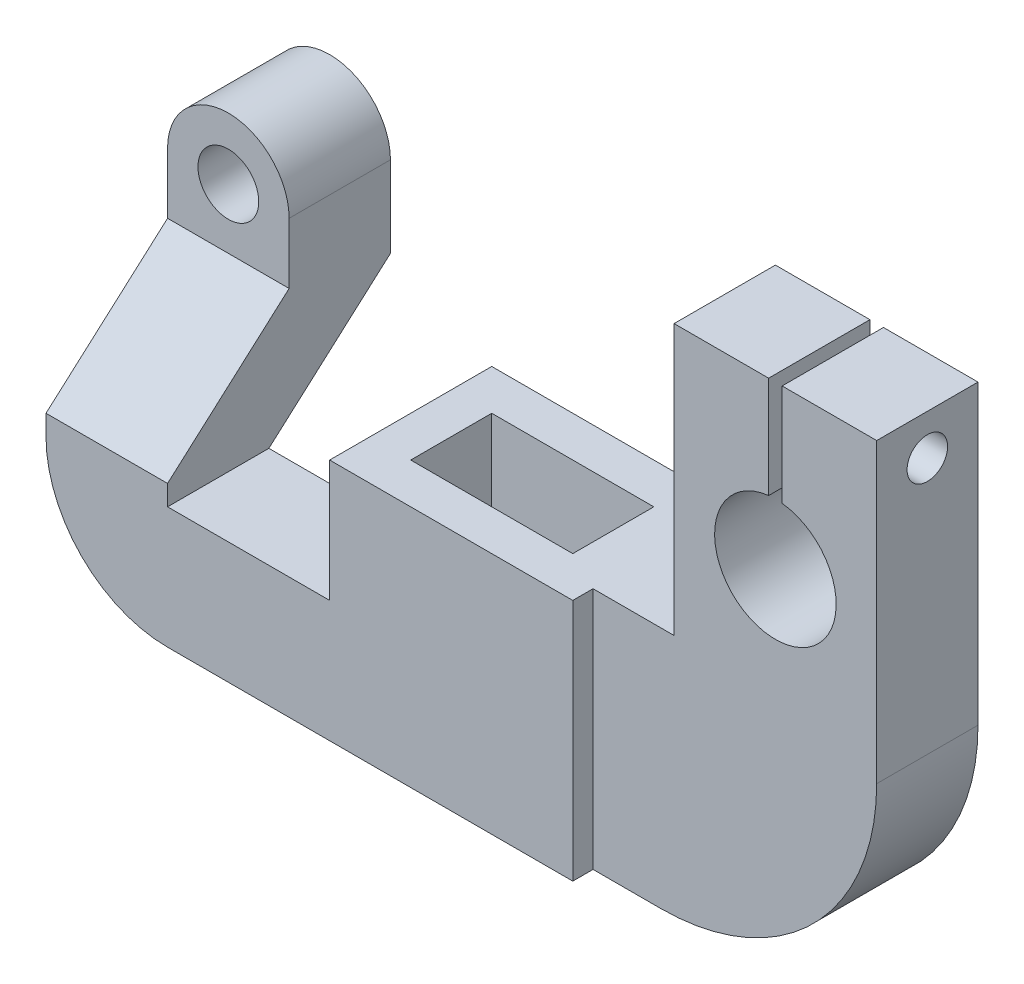
ISO-10303-21;
HEADER;
FILE_DESCRIPTION(('STEP AP214'),'2;1');
FILE_NAME('part.step','',(''),(''),'','','');
FILE_SCHEMA(('AUTOMOTIVE_DESIGN { 1 0 10303 214 1 1 1 1 }'));
ENDSEC;
DATA;
#1=APPLICATION_CONTEXT('core data for automotive mechanical design processes');
#2=APPLICATION_PROTOCOL_DEFINITION('international standard','automotive_design',2000,#1);
#3=PRODUCT_CONTEXT('',#1,'mechanical');
#4=PRODUCT('Part','Part','',(#3));
#5=PRODUCT_RELATED_PRODUCT_CATEGORY('part','',(#4));
#6=PRODUCT_DEFINITION_FORMATION('','',#4);
#7=PRODUCT_DEFINITION_CONTEXT('part definition',#1,'design');
#8=PRODUCT_DEFINITION('design','',#6,#7);
#9=PRODUCT_DEFINITION_SHAPE('','',#8);
#10=(LENGTH_UNIT() NAMED_UNIT(*) SI_UNIT(.MILLI.,.METRE.));
#11=(NAMED_UNIT(*) PLANE_ANGLE_UNIT() SI_UNIT($,.RADIAN.));
#12=(NAMED_UNIT(*) SI_UNIT($,.STERADIAN.) SOLID_ANGLE_UNIT());
#13=UNCERTAINTY_MEASURE_WITH_UNIT(LENGTH_MEASURE(1.E-05),#10,'distance_accuracy_value','');
#14=(GEOMETRIC_REPRESENTATION_CONTEXT(3) GLOBAL_UNCERTAINTY_ASSIGNED_CONTEXT((#13)) GLOBAL_UNIT_ASSIGNED_CONTEXT((#10,
#11,#12)) REPRESENTATION_CONTEXT('',''));
#15=CARTESIAN_POINT('',(0.,0.,0.));
#16=DIRECTION('',(0.,0.,1.));
#17=DIRECTION('',(1.,0.,0.));
#18=AXIS2_PLACEMENT_3D('',#15,#16,#17);
#19=CARTESIAN_POINT('',(-36.,-36.,0.));
#20=DIRECTION('',(-1.,0.,0.));
#21=DIRECTION('',(0.,0.,1.));
#22=AXIS2_PLACEMENT_3D('',#19,#20,#21);
#23=PLANE('',#22);
#24=DIRECTION('',(0.,0.,1.));
#25=VECTOR('',#24,1.);
#26=CARTESIAN_POINT('',(-36.,-36.,0.));
#27=LINE('',#26,#25);
#28=CARTESIAN_POINT('',(-36.,-36.,-6.));
#29=VERTEX_POINT('',#28);
#30=CARTESIAN_POINT('',(-36.,-36.,3.00000000000001));
#31=VERTEX_POINT('',#30);
#32=EDGE_CURVE('E320',#29,#31,#27,.T.);
#33=ORIENTED_EDGE('',*,*,#32,.T.);
#34=DIRECTION('',(0.,1.,0.));
#35=VECTOR('',#34,1.);
#36=CARTESIAN_POINT('',(-36.,-18.,3.00000000000001));
#37=LINE('',#36,#35);
#38=CARTESIAN_POINT('',(-36.,-18.,3.00000000000001));
#39=VERTEX_POINT('',#38);
#40=EDGE_CURVE('E294',#31,#39,#37,.T.);
#41=ORIENTED_EDGE('',*,*,#40,.T.);
#42=DIRECTION('',(0.,0.,1.));
#43=VECTOR('',#42,1.);
#44=CARTESIAN_POINT('',(-36.,-18.,3.00000000000001));
#45=LINE('',#44,#43);
#46=CARTESIAN_POINT('',(-36.,-18.,18.));
#47=VERTEX_POINT('',#46);
#48=EDGE_CURVE('E303',#39,#47,#45,.T.);
#49=ORIENTED_EDGE('',*,*,#48,.T.);
#50=DIRECTION('',(0.,1.,0.));
#51=VECTOR('',#50,1.);
#52=CARTESIAN_POINT('',(-36.,-36.,18.));
#53=LINE('',#52,#51);
#54=CARTESIAN_POINT('',(-36.,0.,18.));
#55=VERTEX_POINT('',#54);
#56=EDGE_CURVE('E368',#47,#55,#53,.T.);
#57=ORIENTED_EDGE('',*,*,#56,.T.);
#58=DIRECTION('',(0.,0.,1.));
#59=VECTOR('',#58,1.);
#60=CARTESIAN_POINT('',(-36.,0.,0.));
#61=LINE('',#60,#59);
#62=CARTESIAN_POINT('',(-36.,0.,-6.));
#63=VERTEX_POINT('',#62);
#64=EDGE_CURVE('E344',#63,#55,#61,.T.);
#65=ORIENTED_EDGE('',*,*,#64,.F.);
#66=DIRECTION('',(0.,1.,0.));
#67=VECTOR('',#66,1.);
#68=CARTESIAN_POINT('',(-36.,-36.,-6.));
#69=LINE('',#68,#67);
#70=EDGE_CURVE('E370',#29,#63,#69,.T.);
#71=ORIENTED_EDGE('',*,*,#70,.F.);
#72=EDGE_LOOP('',(#33,#41,#49,#57,#65,#71));
#73=FACE_BOUND('',#72,.T.);
#74=ADVANCED_FACE('F35',(#73),#23,.T.);
#75=CARTESIAN_POINT('',(42.,-36.,15.));
#76=DIRECTION('',(0.,1.,0.));
#77=DIRECTION('',(-1.,0.,0.));
#78=AXIS2_PLACEMENT_3D('',#75,#76,#77);
#79=PLANE('',#78);
#80=DIRECTION('',(1.,0.,0.));
#81=VECTOR('',#80,1.);
#82=CARTESIAN_POINT('',(42.,-36.,0.));
#83=LINE('',#82,#81);
#84=CARTESIAN_POINT('',(0.,-36.,0.));
#85=VERTEX_POINT('',#84);
#86=CARTESIAN_POINT('',(10.,-36.,0.));
#87=VERTEX_POINT('',#86);
#88=EDGE_CURVE('E401',#85,#87,#83,.T.);
#89=ORIENTED_EDGE('',*,*,#88,.T.);
#90=DIRECTION('',(0.,0.,-1.));
#91=VECTOR('',#90,1.);
#92=CARTESIAN_POINT('',(10.,-36.,15.));
#93=LINE('',#92,#91);
#94=CARTESIAN_POINT('',(10.,-36.,15.));
#95=VERTEX_POINT('',#94);
#96=EDGE_CURVE('E43',#87,#95,#93,.F.);
#97=ORIENTED_EDGE('',*,*,#96,.T.);
#98=DIRECTION('',(1.,0.,0.));
#99=VECTOR('',#98,1.);
#100=CARTESIAN_POINT('',(42.,-36.,15.));
#101=LINE('',#100,#99);
#102=CARTESIAN_POINT('',(0.,-36.,15.));
#103=VERTEX_POINT('',#102);
#104=EDGE_CURVE('E379',#103,#95,#101,.T.);
#105=ORIENTED_EDGE('',*,*,#104,.F.);
#106=DIRECTION('',(0.,0.,-1.));
#107=VECTOR('',#106,1.);
#108=CARTESIAN_POINT('',(0.,-36.,0.));
#109=LINE('',#108,#107);
#110=CARTESIAN_POINT('',(0.,-36.,18.));
#111=VERTEX_POINT('',#110);
#112=EDGE_CURVE('E315',#111,#103,#109,.T.);
#113=ORIENTED_EDGE('',*,*,#112,.F.);
#114=DIRECTION('',(1.,0.,0.));
#115=VECTOR('',#114,1.);
#116=CARTESIAN_POINT('',(0.,-36.,18.));
#117=LINE('',#116,#115);
#118=CARTESIAN_POINT('',(-60.,-36.,18.));
#119=VERTEX_POINT('',#118);
#120=EDGE_CURVE('E311',#119,#111,#117,.T.);
#121=ORIENTED_EDGE('',*,*,#120,.F.);
#122=DIRECTION('',(0.,0.,1.));
#123=VECTOR('',#122,1.);
#124=CARTESIAN_POINT('',(-60.,-36.,3.00000000000001));
#125=LINE('',#124,#123);
#126=CARTESIAN_POINT('',(-60.,-36.,3.00000000000001));
#127=VERTEX_POINT('',#126);
#128=EDGE_CURVE('E448',#119,#127,#125,.F.);
#129=ORIENTED_EDGE('',*,*,#128,.T.);
#130=DIRECTION('',(1.,0.,0.));
#131=VECTOR('',#130,1.);
#132=CARTESIAN_POINT('',(-36.,-36.,3.00000000000001));
#133=LINE('',#132,#131);
#134=EDGE_CURVE('E301',#127,#31,#133,.T.);
#135=ORIENTED_EDGE('',*,*,#134,.T.);
#136=ORIENTED_EDGE('',*,*,#32,.F.);
#137=DIRECTION('',(-1.,0.,0.));
#138=VECTOR('',#137,1.);
#139=CARTESIAN_POINT('',(0.,-36.,-6.));
#140=LINE('',#139,#138);
#141=CARTESIAN_POINT('',(0.,-36.,-6.));
#142=VERTEX_POINT('',#141);
#143=EDGE_CURVE('E317',#142,#29,#140,.T.);
#144=ORIENTED_EDGE('',*,*,#143,.F.);
#145=EDGE_CURVE('E313',#85,#142,#109,.T.);
#146=ORIENTED_EDGE('',*,*,#145,.F.);
#147=EDGE_LOOP('',(#89,#97,#105,#113,#121,#129,#135,#136,#144,#146));
#148=FACE_BOUND('',#147,.T.);
#149=DIRECTION('',(-1.,0.,0.));
#150=VECTOR('',#149,1.);
#151=CARTESIAN_POINT('',(0.,-36.,12.));
#152=LINE('',#151,#150);
#153=CARTESIAN_POINT('',(-6.,-36.,12.));
#154=VERTEX_POINT('',#153);
#155=CARTESIAN_POINT('',(-30.,-36.,12.));
#156=VERTEX_POINT('',#155);
#157=EDGE_CURVE('E323',#154,#156,#152,.T.);
#158=ORIENTED_EDGE('',*,*,#157,.F.);
#159=DIRECTION('',(0.,0.,-1.));
#160=VECTOR('',#159,1.);
#161=CARTESIAN_POINT('',(-6.,-36.,0.));
#162=LINE('',#161,#160);
#163=CARTESIAN_POINT('',(-6.,-36.,0.));
#164=VERTEX_POINT('',#163);
#165=EDGE_CURVE('E331',#154,#164,#162,.T.);
#166=ORIENTED_EDGE('',*,*,#165,.T.);
#167=DIRECTION('',(-1.,0.,0.));
#168=VECTOR('',#167,1.);
#169=CARTESIAN_POINT('',(0.,-36.,0.));
#170=LINE('',#169,#168);
#171=CARTESIAN_POINT('',(-30.,-36.,0.));
#172=VERTEX_POINT('',#171);
#173=EDGE_CURVE('E329',#164,#172,#170,.T.);
#174=ORIENTED_EDGE('',*,*,#173,.T.);
#175=DIRECTION('',(0.,0.,-1.));
#176=VECTOR('',#175,1.);
#177=CARTESIAN_POINT('',(-30.,-36.,0.));
#178=LINE('',#177,#176);
#179=EDGE_CURVE('E326',#156,#172,#178,.T.);
#180=ORIENTED_EDGE('',*,*,#179,.F.);
#181=EDGE_LOOP('',(#158,#166,#174,#180));
#182=FACE_BOUND('',#181,.T.);
#183=ADVANCED_FACE('F486',(#148,#182),#79,.F.);
#184=CARTESIAN_POINT('',(42.,40.,15.));
#185=DIRECTION('',(-1.,0.,0.));
#186=DIRECTION('',(0.,-1.,0.));
#187=AXIS2_PLACEMENT_3D('',#184,#185,#186);
#188=PLANE('',#187);
#189=CARTESIAN_POINT('',(42.,34.,7.5));
#190=DIRECTION('',(1.,0.,0.));
#191=DIRECTION('',(0.,1.,0.));
#192=AXIS2_PLACEMENT_3D('',#189,#190,#191);
#193=CIRCLE('',#192,3.);
#194=CARTESIAN_POINT('',(42.,37.,7.5));
#195=VERTEX_POINT('',#194);
#196=EDGE_CURVE('E277',#195,#195,#193,.T.);
#197=ORIENTED_EDGE('',*,*,#196,.F.);
#198=EDGE_LOOP('',(#197));
#199=FACE_BOUND('',#198,.T.);
#200=DIRECTION('',(0.,1.,0.));
#201=VECTOR('',#200,1.);
#202=CARTESIAN_POINT('',(42.,40.,15.));
#203=LINE('',#202,#201);
#204=CARTESIAN_POINT('',(42.,-4.,15.));
#205=VERTEX_POINT('',#204);
#206=CARTESIAN_POINT('',(42.,40.,15.));
#207=VERTEX_POINT('',#206);
#208=EDGE_CURVE('E382',#205,#207,#203,.T.);
#209=ORIENTED_EDGE('',*,*,#208,.F.);
#210=DIRECTION('',(0.,0.,-1.));
#211=VECTOR('',#210,1.);
#212=CARTESIAN_POINT('',(42.,-4.,15.));
#213=LINE('',#212,#211);
#214=CARTESIAN_POINT('',(42.,-4.,0.));
#215=VERTEX_POINT('',#214);
#216=EDGE_CURVE('E452',#205,#215,#213,.T.);
#217=ORIENTED_EDGE('',*,*,#216,.T.);
#218=DIRECTION('',(0.,1.,0.));
#219=VECTOR('',#218,1.);
#220=CARTESIAN_POINT('',(42.,40.,0.));
#221=LINE('',#220,#219);
#222=CARTESIAN_POINT('',(42.,40.,0.));
#223=VERTEX_POINT('',#222);
#224=EDGE_CURVE('E403',#215,#223,#221,.T.);
#225=ORIENTED_EDGE('',*,*,#224,.T.);
#226=DIRECTION('',(0.,0.,-1.));
#227=VECTOR('',#226,1.);
#228=CARTESIAN_POINT('',(42.,40.,15.));
#229=LINE('',#228,#227);
#230=EDGE_CURVE('E436',#207,#223,#229,.T.);
#231=ORIENTED_EDGE('',*,*,#230,.F.);
#232=EDGE_LOOP('',(#209,#217,#225,#231));
#233=FACE_BOUND('',#232,.T.);
#234=ADVANCED_FACE('F458',(#199,#233),#188,.F.);
#235=CARTESIAN_POINT('',(28.,40.,15.));
#236=DIRECTION('',(0.,-1.,0.));
#237=DIRECTION('',(0.,0.,-1.));
#238=AXIS2_PLACEMENT_3D('',#235,#236,#237);
#239=PLANE('',#238);
#240=DIRECTION('',(-1.,0.,0.));
#241=VECTOR('',#240,1.);
#242=CARTESIAN_POINT('',(28.,40.,0.));
#243=LINE('',#242,#241);
#244=CARTESIAN_POINT('',(28.,40.,0.));
#245=VERTEX_POINT('',#244);
#246=EDGE_CURVE('E405',#223,#245,#243,.T.);
#247=ORIENTED_EDGE('',*,*,#246,.T.);
#248=DIRECTION('',(0.,0.,-1.));
#249=VECTOR('',#248,1.);
#250=CARTESIAN_POINT('',(28.,40.,15.));
#251=LINE('',#250,#249);
#252=CARTESIAN_POINT('',(28.,40.,15.));
#253=VERTEX_POINT('',#252);
#254=EDGE_CURVE('E433',#253,#245,#251,.T.);
#255=ORIENTED_EDGE('',*,*,#254,.F.);
#256=DIRECTION('',(-1.,0.,0.));
#257=VECTOR('',#256,1.);
#258=CARTESIAN_POINT('',(28.,40.,15.));
#259=LINE('',#258,#257);
#260=EDGE_CURVE('E384',#207,#253,#259,.T.);
#261=ORIENTED_EDGE('',*,*,#260,.F.);
#262=ORIENTED_EDGE('',*,*,#230,.T.);
#263=EDGE_LOOP('',(#247,#255,#261,#262));
#264=FACE_BOUND('',#263,.T.);
#265=ADVANCED_FACE('F468',(#264),#239,.F.);
#266=CARTESIAN_POINT('',(28.,40.,15.));
#267=DIRECTION('',(1.,0.,0.));
#268=DIRECTION('',(0.,0.,-1.));
#269=AXIS2_PLACEMENT_3D('',#266,#267,#268);
#270=PLANE('',#269);
#271=CARTESIAN_POINT('',(28.,34.,7.5));
#272=DIRECTION('',(1.,0.,0.));
#273=DIRECTION('',(0.,0.,-1.));
#274=AXIS2_PLACEMENT_3D('',#271,#272,#273);
#275=CIRCLE('',#274,3.);
#276=CARTESIAN_POINT('',(28.,34.,4.5));
#277=VERTEX_POINT('',#276);
#278=EDGE_CURVE('E290',#277,#277,#275,.T.);
#279=ORIENTED_EDGE('',*,*,#278,.T.);
#280=EDGE_LOOP('',(#279));
#281=FACE_BOUND('',#280,.T.);
#282=DIRECTION('',(0.,-1.,0.));
#283=VECTOR('',#282,1.);
#284=CARTESIAN_POINT('',(28.,40.,0.));
#285=LINE('',#284,#283);
#286=CARTESIAN_POINT('',(28.,24.9442719099992,0.));
#287=VERTEX_POINT('',#286);
#288=EDGE_CURVE('E407',#245,#287,#285,.T.);
#289=ORIENTED_EDGE('',*,*,#288,.T.);
#290=DIRECTION('',(0.,0.,-1.));
#291=VECTOR('',#290,1.);
#292=CARTESIAN_POINT('',(28.,24.9442719099992,15.));
#293=LINE('',#292,#291);
#294=CARTESIAN_POINT('',(28.,24.9442719099992,15.));
#295=VERTEX_POINT('',#294);
#296=EDGE_CURVE('E430',#295,#287,#293,.T.);
#297=ORIENTED_EDGE('',*,*,#296,.F.);
#298=DIRECTION('',(0.,-1.,0.));
#299=VECTOR('',#298,1.);
#300=CARTESIAN_POINT('',(28.,40.,15.));
#301=LINE('',#300,#299);
#302=EDGE_CURVE('E386',#253,#295,#301,.T.);
#303=ORIENTED_EDGE('',*,*,#302,.F.);
#304=ORIENTED_EDGE('',*,*,#254,.T.);
#305=EDGE_LOOP('',(#289,#297,#303,#304));
#306=FACE_BOUND('',#305,.T.);
#307=ADVANCED_FACE('F472',(#281,#306),#270,.F.);
#308=CARTESIAN_POINT('',(27.,16.,15.));
#309=DIRECTION('',(0.,0.,-1.));
#310=DIRECTION('',(-1.,0.,0.));
#311=AXIS2_PLACEMENT_3D('',#308,#309,#310);
#312=CYLINDRICAL_SURFACE('',#311,9.00000000000001);
#313=CARTESIAN_POINT('',(27.,16.,0.));
#314=DIRECTION('',(0.,0.,-1.));
#315=DIRECTION('',(1.,0.,0.));
#316=AXIS2_PLACEMENT_3D('',#313,#314,#315);
#317=CIRCLE('',#316,9.00000000000001);
#318=CARTESIAN_POINT('',(26.,24.9442719099992,0.));
#319=VERTEX_POINT('',#318);
#320=EDGE_CURVE('E409',#287,#319,#317,.T.);
#321=ORIENTED_EDGE('',*,*,#320,.T.);
#322=DIRECTION('',(0.,0.,-1.));
#323=VECTOR('',#322,1.);
#324=CARTESIAN_POINT('',(26.,24.9442719099992,15.));
#325=LINE('',#324,#323);
#326=CARTESIAN_POINT('',(26.,24.9442719099992,15.));
#327=VERTEX_POINT('',#326);
#328=EDGE_CURVE('E427',#327,#319,#325,.T.);
#329=ORIENTED_EDGE('',*,*,#328,.F.);
#330=CARTESIAN_POINT('',(27.,16.,15.));
#331=DIRECTION('',(0.,0.,-1.));
#332=DIRECTION('',(1.,0.,0.));
#333=AXIS2_PLACEMENT_3D('',#330,#331,#332);
#334=CIRCLE('',#333,9.00000000000001);
#335=EDGE_CURVE('E388',#295,#327,#334,.T.);
#336=ORIENTED_EDGE('',*,*,#335,.F.);
#337=ORIENTED_EDGE('',*,*,#296,.T.);
#338=EDGE_LOOP('',(#321,#329,#336,#337));
#339=FACE_BOUND('',#338,.T.);
#340=ADVANCED_FACE('F531',(#339),#312,.F.);
#341=CARTESIAN_POINT('',(26.,40.,15.));
#342=DIRECTION('',(-1.,0.,0.));
#343=DIRECTION('',(0.,0.,1.));
#344=AXIS2_PLACEMENT_3D('',#341,#342,#343);
#345=PLANE('',#344);
#346=CARTESIAN_POINT('',(26.,34.,7.5));
#347=DIRECTION('',(-1.,0.,0.));
#348=DIRECTION('',(0.,0.,1.));
#349=AXIS2_PLACEMENT_3D('',#346,#347,#348);
#350=CIRCLE('',#349,3.);
#351=CARTESIAN_POINT('',(26.,34.,10.5));
#352=VERTEX_POINT('',#351);
#353=EDGE_CURVE('E287',#352,#352,#350,.T.);
#354=ORIENTED_EDGE('',*,*,#353,.T.);
#355=EDGE_LOOP('',(#354));
#356=FACE_BOUND('',#355,.T.);
#357=DIRECTION('',(0.,1.,0.));
#358=VECTOR('',#357,1.);
#359=CARTESIAN_POINT('',(26.,40.,0.));
#360=LINE('',#359,#358);
#361=CARTESIAN_POINT('',(26.,40.,0.));
#362=VERTEX_POINT('',#361);
#363=EDGE_CURVE('E411',#319,#362,#360,.T.);
#364=ORIENTED_EDGE('',*,*,#363,.T.);
#365=DIRECTION('',(0.,0.,-1.));
#366=VECTOR('',#365,1.);
#367=CARTESIAN_POINT('',(26.,40.,15.));
#368=LINE('',#367,#366);
#369=CARTESIAN_POINT('',(26.,40.,15.));
#370=VERTEX_POINT('',#369);
#371=EDGE_CURVE('E424',#370,#362,#368,.T.);
#372=ORIENTED_EDGE('',*,*,#371,.F.);
#373=DIRECTION('',(0.,1.,0.));
#374=VECTOR('',#373,1.);
#375=CARTESIAN_POINT('',(26.,40.,15.));
#376=LINE('',#375,#374);
#377=EDGE_CURVE('E390',#327,#370,#376,.T.);
#378=ORIENTED_EDGE('',*,*,#377,.F.);
#379=ORIENTED_EDGE('',*,*,#328,.T.);
#380=EDGE_LOOP('',(#364,#372,#378,#379));
#381=FACE_BOUND('',#380,.T.);
#382=ADVANCED_FACE('F527',(#356,#381),#345,.F.);
#383=CARTESIAN_POINT('',(26.,40.,15.));
#384=DIRECTION('',(0.,-1.,0.));
#385=DIRECTION('',(0.,0.,-1.));
#386=AXIS2_PLACEMENT_3D('',#383,#384,#385);
#387=PLANE('',#386);
#388=DIRECTION('',(-1.,0.,0.));
#389=VECTOR('',#388,1.);
#390=CARTESIAN_POINT('',(26.,40.,0.));
#391=LINE('',#390,#389);
#392=CARTESIAN_POINT('',(12.,40.,0.));
#393=VERTEX_POINT('',#392);
#394=EDGE_CURVE('E413',#362,#393,#391,.T.);
#395=ORIENTED_EDGE('',*,*,#394,.T.);
#396=DIRECTION('',(0.,0.,-1.));
#397=VECTOR('',#396,1.);
#398=CARTESIAN_POINT('',(12.,40.,15.));
#399=LINE('',#398,#397);
#400=CARTESIAN_POINT('',(12.,40.,15.));
#401=VERTEX_POINT('',#400);
#402=EDGE_CURVE('E421',#401,#393,#399,.T.);
#403=ORIENTED_EDGE('',*,*,#402,.F.);
#404=DIRECTION('',(-1.,0.,0.));
#405=VECTOR('',#404,1.);
#406=CARTESIAN_POINT('',(26.,40.,15.));
#407=LINE('',#406,#405);
#408=EDGE_CURVE('E392',#370,#401,#407,.T.);
#409=ORIENTED_EDGE('',*,*,#408,.F.);
#410=ORIENTED_EDGE('',*,*,#371,.T.);
#411=EDGE_LOOP('',(#395,#403,#409,#410));
#412=FACE_BOUND('',#411,.T.);
#413=ADVANCED_FACE('F523',(#412),#387,.F.);
#414=CARTESIAN_POINT('',(12.,0.,15.));
#415=DIRECTION('',(1.,0.,0.));
#416=DIRECTION('',(0.,0.,-1.));
#417=AXIS2_PLACEMENT_3D('',#414,#415,#416);
#418=PLANE('',#417);
#419=CARTESIAN_POINT('',(12.,34.,7.5));
#420=DIRECTION('',(1.,0.,0.));
#421=DIRECTION('',(0.,0.,-1.));
#422=AXIS2_PLACEMENT_3D('',#419,#420,#421);
#423=CIRCLE('',#422,3.);
#424=CARTESIAN_POINT('',(12.,34.,4.5));
#425=VERTEX_POINT('',#424);
#426=EDGE_CURVE('E286',#425,#425,#423,.T.);
#427=ORIENTED_EDGE('',*,*,#426,.T.);
#428=EDGE_LOOP('',(#427));
#429=FACE_BOUND('',#428,.T.);
#430=DIRECTION('',(0.,-1.,0.));
#431=VECTOR('',#430,1.);
#432=CARTESIAN_POINT('',(12.,0.,0.));
#433=LINE('',#432,#431);
#434=CARTESIAN_POINT('',(12.,0.,0.));
#435=VERTEX_POINT('',#434);
#436=EDGE_CURVE('E415',#393,#435,#433,.T.);
#437=ORIENTED_EDGE('',*,*,#436,.T.);
#438=DIRECTION('',(0.,0.,-1.));
#439=VECTOR('',#438,1.);
#440=CARTESIAN_POINT('',(12.,0.,15.));
#441=LINE('',#440,#439);
#442=CARTESIAN_POINT('',(12.,0.,15.));
#443=VERTEX_POINT('',#442);
#444=EDGE_CURVE('E399',#443,#435,#441,.T.);
#445=ORIENTED_EDGE('',*,*,#444,.F.);
#446=DIRECTION('',(0.,-1.,0.));
#447=VECTOR('',#446,1.);
#448=CARTESIAN_POINT('',(12.,0.,15.));
#449=LINE('',#448,#447);
#450=EDGE_CURVE('E394',#401,#443,#449,.T.);
#451=ORIENTED_EDGE('',*,*,#450,.F.);
#452=ORIENTED_EDGE('',*,*,#402,.T.);
#453=EDGE_LOOP('',(#437,#445,#451,#452));
#454=FACE_BOUND('',#453,.T.);
#455=ADVANCED_FACE('F519',(#429,#454),#418,.F.);
#456=CARTESIAN_POINT('',(0.,0.,15.));
#457=DIRECTION('',(0.,-1.,0.));
#458=DIRECTION('',(0.,0.,-1.));
#459=AXIS2_PLACEMENT_3D('',#456,#457,#458);
#460=PLANE('',#459);
#461=DIRECTION('',(-1.,0.,0.));
#462=VECTOR('',#461,1.);
#463=CARTESIAN_POINT('',(0.,0.,0.));
#464=LINE('',#463,#462);
#465=CARTESIAN_POINT('',(0.,0.,0.));
#466=VERTEX_POINT('',#465);
#467=EDGE_CURVE('E380',#435,#466,#464,.T.);
#468=ORIENTED_EDGE('',*,*,#467,.T.);
#469=DIRECTION('',(0.,0.,-1.));
#470=VECTOR('',#469,1.);
#471=CARTESIAN_POINT('',(0.,0.,0.));
#472=LINE('',#471,#470);
#473=CARTESIAN_POINT('',(0.,0.,-6.));
#474=VERTEX_POINT('',#473);
#475=EDGE_CURVE('E337',#466,#474,#472,.T.);
#476=ORIENTED_EDGE('',*,*,#475,.T.);
#477=DIRECTION('',(-1.,0.,0.));
#478=VECTOR('',#477,1.);
#479=CARTESIAN_POINT('',(0.,0.,-6.));
#480=LINE('',#479,#478);
#481=EDGE_CURVE('E341',#474,#63,#480,.T.);
#482=ORIENTED_EDGE('',*,*,#481,.T.);
#483=ORIENTED_EDGE('',*,*,#64,.T.);
#484=DIRECTION('',(1.,0.,0.));
#485=VECTOR('',#484,1.);
#486=CARTESIAN_POINT('',(0.,0.,18.));
#487=LINE('',#486,#485);
#488=CARTESIAN_POINT('',(0.,0.,18.));
#489=VERTEX_POINT('',#488);
#490=EDGE_CURVE('E310',#55,#489,#487,.T.);
#491=ORIENTED_EDGE('',*,*,#490,.T.);
#492=CARTESIAN_POINT('',(0.,0.,15.));
#493=VERTEX_POINT('',#492);
#494=EDGE_CURVE('E338',#489,#493,#472,.T.);
#495=ORIENTED_EDGE('',*,*,#494,.T.);
#496=DIRECTION('',(-1.,0.,0.));
#497=VECTOR('',#496,1.);
#498=CARTESIAN_POINT('',(0.,0.,15.));
#499=LINE('',#498,#497);
#500=EDGE_CURVE('E396',#443,#493,#499,.T.);
#501=ORIENTED_EDGE('',*,*,#500,.F.);
#502=ORIENTED_EDGE('',*,*,#444,.T.);
#503=EDGE_LOOP('',(#468,#476,#482,#483,#491,#495,#501,#502));
#504=FACE_BOUND('',#503,.T.);
#505=DIRECTION('',(-1.,0.,0.));
#506=VECTOR('',#505,1.);
#507=CARTESIAN_POINT('',(0.,0.,12.));
#508=LINE('',#507,#506);
#509=CARTESIAN_POINT('',(-6.,0.,12.));
#510=VERTEX_POINT('',#509);
#511=CARTESIAN_POINT('',(-30.,0.,12.));
#512=VERTEX_POINT('',#511);
#513=EDGE_CURVE('E347',#510,#512,#508,.T.);
#514=ORIENTED_EDGE('',*,*,#513,.T.);
#515=DIRECTION('',(0.,0.,-1.));
#516=VECTOR('',#515,1.);
#517=CARTESIAN_POINT('',(-30.,0.,0.));
#518=LINE('',#517,#516);
#519=CARTESIAN_POINT('',(-30.,0.,0.));
#520=VERTEX_POINT('',#519);
#521=EDGE_CURVE('E350',#512,#520,#518,.T.);
#522=ORIENTED_EDGE('',*,*,#521,.T.);
#523=DIRECTION('',(-1.,0.,0.));
#524=VECTOR('',#523,1.);
#525=CARTESIAN_POINT('',(0.,0.,0.));
#526=LINE('',#525,#524);
#527=CARTESIAN_POINT('',(-6.,0.,0.));
#528=VERTEX_POINT('',#527);
#529=EDGE_CURVE('E353',#528,#520,#526,.T.);
#530=ORIENTED_EDGE('',*,*,#529,.F.);
#531=DIRECTION('',(0.,0.,-1.));
#532=VECTOR('',#531,1.);
#533=CARTESIAN_POINT('',(-6.,0.,0.));
#534=LINE('',#533,#532);
#535=EDGE_CURVE('E314',#510,#528,#534,.T.);
#536=ORIENTED_EDGE('',*,*,#535,.F.);
#537=EDGE_LOOP('',(#514,#522,#530,#536));
#538=FACE_BOUND('',#537,.T.);
#539=ADVANCED_FACE('F514',(#504,#538),#460,.F.);
#540=CARTESIAN_POINT('',(27.,16.,15.));
#541=DIRECTION('',(0.,0.,1.));
#542=DIRECTION('',(1.,0.,0.));
#543=AXIS2_PLACEMENT_3D('',#540,#541,#542);
#544=PLANE('',#543);
#545=ORIENTED_EDGE('',*,*,#104,.T.);
#546=CARTESIAN_POINT('',(10.,-4.,15.));
#547=DIRECTION('',(0.,0.,1.));
#548=DIRECTION('',(1.,0.,0.));
#549=AXIS2_PLACEMENT_3D('',#546,#547,#548);
#550=CIRCLE('',#549,32.);
#551=EDGE_CURVE('E11',#95,#205,#550,.T.);
#552=ORIENTED_EDGE('',*,*,#551,.T.);
#553=ORIENTED_EDGE('',*,*,#208,.T.);
#554=ORIENTED_EDGE('',*,*,#260,.T.);
#555=ORIENTED_EDGE('',*,*,#302,.T.);
#556=ORIENTED_EDGE('',*,*,#335,.T.);
#557=ORIENTED_EDGE('',*,*,#377,.T.);
#558=ORIENTED_EDGE('',*,*,#408,.T.);
#559=ORIENTED_EDGE('',*,*,#450,.T.);
#560=ORIENTED_EDGE('',*,*,#500,.T.);
#561=DIRECTION('',(0.,-1.,0.));
#562=VECTOR('',#561,1.);
#563=CARTESIAN_POINT('',(0.,-36.,15.));
#564=LINE('',#563,#562);
#565=EDGE_CURVE('E376',#493,#103,#564,.T.);
#566=ORIENTED_EDGE('',*,*,#565,.T.);
#567=EDGE_LOOP('',(#545,#552,#553,#554,#555,#556,#557,#558,#559,#560,#566));
#568=FACE_BOUND('',#567,.T.);
#569=ADVANCED_FACE('F476',(#568),#544,.T.);
#570=CARTESIAN_POINT('',(27.,16.,0.));
#571=DIRECTION('',(0.,0.,1.));
#572=DIRECTION('',(1.,0.,0.));
#573=AXIS2_PLACEMENT_3D('',#570,#571,#572);
#574=PLANE('',#573);
#575=ORIENTED_EDGE('',*,*,#224,.F.);
#576=CARTESIAN_POINT('',(10.,-4.,0.));
#577=DIRECTION('',(0.,0.,1.));
#578=DIRECTION('',(1.,0.,0.));
#579=AXIS2_PLACEMENT_3D('',#576,#577,#578);
#580=CIRCLE('',#579,32.);
#581=EDGE_CURVE('E57',#215,#87,#580,.F.);
#582=ORIENTED_EDGE('',*,*,#581,.T.);
#583=ORIENTED_EDGE('',*,*,#88,.F.);
#584=DIRECTION('',(0.,-1.,0.));
#585=VECTOR('',#584,1.);
#586=CARTESIAN_POINT('',(0.,-36.,0.));
#587=LINE('',#586,#585);
#588=EDGE_CURVE('E360',#466,#85,#587,.T.);
#589=ORIENTED_EDGE('',*,*,#588,.F.);
#590=ORIENTED_EDGE('',*,*,#467,.F.);
#591=ORIENTED_EDGE('',*,*,#436,.F.);
#592=ORIENTED_EDGE('',*,*,#394,.F.);
#593=ORIENTED_EDGE('',*,*,#363,.F.);
#594=ORIENTED_EDGE('',*,*,#320,.F.);
#595=ORIENTED_EDGE('',*,*,#288,.F.);
#596=ORIENTED_EDGE('',*,*,#246,.F.);
#597=EDGE_LOOP('',(#575,#582,#583,#589,#590,#591,#592,#593,#594,#595,#596));
#598=FACE_BOUND('',#597,.T.);
#599=ADVANCED_FACE('F463',(#598),#574,.F.);
#600=CARTESIAN_POINT('',(0.,-36.,0.));
#601=DIRECTION('',(1.,0.,0.));
#602=DIRECTION('',(0.,0.,-1.));
#603=AXIS2_PLACEMENT_3D('',#600,#601,#602);
#604=PLANE('',#603);
#605=ORIENTED_EDGE('',*,*,#565,.F.);
#606=ORIENTED_EDGE('',*,*,#494,.F.);
#607=DIRECTION('',(0.,1.,0.));
#608=VECTOR('',#607,1.);
#609=CARTESIAN_POINT('',(0.,-36.,18.));
#610=LINE('',#609,#608);
#611=EDGE_CURVE('E334',#111,#489,#610,.T.);
#612=ORIENTED_EDGE('',*,*,#611,.F.);
#613=ORIENTED_EDGE('',*,*,#112,.T.);
#614=EDGE_LOOP('',(#605,#606,#612,#613));
#615=FACE_BOUND('',#614,.T.);
#616=ADVANCED_FACE('F507',(#615),#604,.T.);
#617=CARTESIAN_POINT('',(0.,-36.,12.));
#618=DIRECTION('',(0.,0.,-1.));
#619=DIRECTION('',(-1.,0.,0.));
#620=AXIS2_PLACEMENT_3D('',#617,#618,#619);
#621=PLANE('',#620);
#622=ORIENTED_EDGE('',*,*,#513,.F.);
#623=DIRECTION('',(0.,1.,0.));
#624=VECTOR('',#623,1.);
#625=CARTESIAN_POINT('',(-6.,-36.,12.));
#626=LINE('',#625,#624);
#627=EDGE_CURVE('E358',#154,#510,#626,.T.);
#628=ORIENTED_EDGE('',*,*,#627,.F.);
#629=ORIENTED_EDGE('',*,*,#157,.T.);
#630=DIRECTION('',(0.,1.,0.));
#631=VECTOR('',#630,1.);
#632=CARTESIAN_POINT('',(-30.,-36.,12.));
#633=LINE('',#632,#631);
#634=EDGE_CURVE('E366',#156,#512,#633,.T.);
#635=ORIENTED_EDGE('',*,*,#634,.T.);
#636=EDGE_LOOP('',(#622,#628,#629,#635));
#637=FACE_BOUND('',#636,.T.);
#638=ADVANCED_FACE('F495',(#637),#621,.T.);
#639=CARTESIAN_POINT('',(-6.,-36.,0.));
#640=DIRECTION('',(1.,0.,0.));
#641=DIRECTION('',(0.,0.,-1.));
#642=AXIS2_PLACEMENT_3D('',#639,#640,#641);
#643=PLANE('',#642);
#644=ORIENTED_EDGE('',*,*,#535,.T.);
#645=DIRECTION('',(0.,1.,0.));
#646=VECTOR('',#645,1.);
#647=CARTESIAN_POINT('',(-6.,-36.,0.));
#648=LINE('',#647,#646);
#649=EDGE_CURVE('E361',#164,#528,#648,.T.);
#650=ORIENTED_EDGE('',*,*,#649,.F.);
#651=ORIENTED_EDGE('',*,*,#165,.F.);
#652=ORIENTED_EDGE('',*,*,#627,.T.);
#653=EDGE_LOOP('',(#644,#650,#651,#652));
#654=FACE_BOUND('',#653,.T.);
#655=ADVANCED_FACE('F577',(#654),#643,.F.);
#656=CARTESIAN_POINT('',(0.,-36.,0.));
#657=DIRECTION('',(0.,0.,-1.));
#658=DIRECTION('',(-1.,0.,0.));
#659=AXIS2_PLACEMENT_3D('',#656,#657,#658);
#660=PLANE('',#659);
#661=ORIENTED_EDGE('',*,*,#529,.T.);
#662=DIRECTION('',(0.,1.,0.));
#663=VECTOR('',#662,1.);
#664=CARTESIAN_POINT('',(-30.,-36.,0.));
#665=LINE('',#664,#663);
#666=EDGE_CURVE('E364',#172,#520,#665,.T.);
#667=ORIENTED_EDGE('',*,*,#666,.F.);
#668=ORIENTED_EDGE('',*,*,#173,.F.);
#669=ORIENTED_EDGE('',*,*,#649,.T.);
#670=EDGE_LOOP('',(#661,#667,#668,#669));
#671=FACE_BOUND('',#670,.T.);
#672=ADVANCED_FACE('F510',(#671),#660,.F.);
#673=CARTESIAN_POINT('',(0.,-36.,18.));
#674=DIRECTION('',(0.,0.,1.));
#675=DIRECTION('',(1.,0.,0.));
#676=AXIS2_PLACEMENT_3D('',#673,#674,#675);
#677=PLANE('',#676);
#678=DIRECTION('',(0.,-1.,0.));
#679=VECTOR('',#678,1.);
#680=CARTESIAN_POINT('',(-78.,-18.,18.));
#681=LINE('',#680,#679);
#682=CARTESIAN_POINT('',(-78.,-15.,18.));
#683=VERTEX_POINT('',#682);
#684=CARTESIAN_POINT('',(-78.,-18.,18.));
#685=VERTEX_POINT('',#684);
#686=EDGE_CURVE('E298',#683,#685,#681,.T.);
#687=ORIENTED_EDGE('',*,*,#686,.T.);
#688=CARTESIAN_POINT('',(-60.,-18.,18.));
#689=DIRECTION('',(0.,0.,1.));
#690=DIRECTION('',(1.,0.,0.));
#691=AXIS2_PLACEMENT_3D('',#688,#689,#690);
#692=CIRCLE('',#691,18.);
#693=EDGE_CURVE('E446',#685,#119,#692,.T.);
#694=ORIENTED_EDGE('',*,*,#693,.T.);
#695=ORIENTED_EDGE('',*,*,#120,.T.);
#696=ORIENTED_EDGE('',*,*,#611,.T.);
#697=ORIENTED_EDGE('',*,*,#490,.F.);
#698=ORIENTED_EDGE('',*,*,#56,.F.);
#699=DIRECTION('',(-1.,0.,0.));
#700=VECTOR('',#699,1.);
#701=CARTESIAN_POINT('',(-36.,-18.,18.));
#702=LINE('',#701,#700);
#703=CARTESIAN_POINT('',(-60.,-18.,18.));
#704=VERTEX_POINT('',#703);
#705=EDGE_CURVE('E293',#47,#704,#702,.T.);
#706=ORIENTED_EDGE('',*,*,#705,.T.);
#707=DIRECTION('',(0.,1.,0.));
#708=VECTOR('',#707,1.);
#709=CARTESIAN_POINT('',(-60.,-18.,18.));
#710=LINE('',#709,#708);
#711=CARTESIAN_POINT('',(-60.,-15.,18.));
#712=VERTEX_POINT('',#711);
#713=EDGE_CURVE('E258',#704,#712,#710,.T.);
#714=ORIENTED_EDGE('',*,*,#713,.T.);
#715=DIRECTION('',(-1.,0.,0.));
#716=VECTOR('',#715,1.);
#717=CARTESIAN_POINT('',(-60.,-15.,18.));
#718=LINE('',#717,#716);
#719=EDGE_CURVE('E266',#712,#683,#718,.T.);
#720=ORIENTED_EDGE('',*,*,#719,.T.);
#721=EDGE_LOOP('',(#687,#694,#695,#696,#697,#698,#706,#714,#720));
#722=FACE_BOUND('',#721,.T.);
#723=ADVANCED_FACE('F501',(#722),#677,.T.);
#724=CARTESIAN_POINT('',(0.,-36.,-6.));
#725=DIRECTION('',(0.,0.,-1.));
#726=DIRECTION('',(-1.,0.,0.));
#727=AXIS2_PLACEMENT_3D('',#724,#725,#726);
#728=PLANE('',#727);
#729=ORIENTED_EDGE('',*,*,#481,.F.);
#730=DIRECTION('',(0.,1.,0.));
#731=VECTOR('',#730,1.);
#732=CARTESIAN_POINT('',(0.,-36.,-6.));
#733=LINE('',#732,#731);
#734=EDGE_CURVE('E372',#142,#474,#733,.T.);
#735=ORIENTED_EDGE('',*,*,#734,.F.);
#736=ORIENTED_EDGE('',*,*,#143,.T.);
#737=ORIENTED_EDGE('',*,*,#70,.T.);
#738=EDGE_LOOP('',(#729,#735,#736,#737));
#739=FACE_BOUND('',#738,.T.);
#740=ADVANCED_FACE('F497',(#739),#728,.T.);
#741=ORIENTED_EDGE('',*,*,#475,.F.);
#742=ORIENTED_EDGE('',*,*,#588,.T.);
#743=ORIENTED_EDGE('',*,*,#145,.T.);
#744=ORIENTED_EDGE('',*,*,#734,.T.);
#745=EDGE_LOOP('',(#741,#742,#743,#744));
#746=FACE_BOUND('',#745,.T.);
#747=ADVANCED_FACE('F500',(#746),#604,.T.);
#748=CARTESIAN_POINT('',(-30.,-36.,0.));
#749=DIRECTION('',(1.,0.,0.));
#750=DIRECTION('',(0.,0.,-1.));
#751=AXIS2_PLACEMENT_3D('',#748,#749,#750);
#752=PLANE('',#751);
#753=ORIENTED_EDGE('',*,*,#521,.F.);
#754=ORIENTED_EDGE('',*,*,#634,.F.);
#755=ORIENTED_EDGE('',*,*,#179,.T.);
#756=ORIENTED_EDGE('',*,*,#666,.T.);
#757=EDGE_LOOP('',(#753,#754,#755,#756));
#758=FACE_BOUND('',#757,.T.);
#759=ADVANCED_FACE('F505',(#758),#752,.T.);
#760=CARTESIAN_POINT('',(-78.,-18.,3.00000000000001));
#761=DIRECTION('',(-1.,0.,0.));
#762=DIRECTION('',(0.,0.,1.));
#763=AXIS2_PLACEMENT_3D('',#760,#761,#762);
#764=PLANE('',#763);
#765=DIRECTION('',(0.,-0.66436383882992,0.74740931868366));
#766=VECTOR('',#765,1.);
#767=CARTESIAN_POINT('',(-78.,-18.,3.00000000000001));
#768=LINE('',#767,#766);
#769=CARTESIAN_POINT('',(-78.,-2.00000000000001,-15.));
#770=VERTEX_POINT('',#769);
#771=CARTESIAN_POINT('',(-78.,-18.,3.00000000000001));
#772=VERTEX_POINT('',#771);
#773=EDGE_CURVE('E259',#770,#772,#768,.T.);
#774=ORIENTED_EDGE('',*,*,#773,.T.);
#775=DIRECTION('',(0.,0.,1.));
#776=VECTOR('',#775,1.);
#777=CARTESIAN_POINT('',(-78.,-18.,18.));
#778=LINE('',#777,#776);
#779=EDGE_CURVE('E439',#772,#685,#778,.T.);
#780=ORIENTED_EDGE('',*,*,#779,.T.);
#781=ORIENTED_EDGE('',*,*,#686,.F.);
#782=DIRECTION('',(0.,0.66436383882992,-0.74740931868366));
#783=VECTOR('',#782,1.);
#784=CARTESIAN_POINT('',(-78.,1.00000000000001,0.));
#785=LINE('',#784,#783);
#786=CARTESIAN_POINT('',(-78.,1.00000000000001,0.));
#787=VERTEX_POINT('',#786);
#788=EDGE_CURVE('E246',#683,#787,#785,.T.);
#789=ORIENTED_EDGE('',*,*,#788,.T.);
#790=DIRECTION('',(0.,1.,0.));
#791=VECTOR('',#790,1.);
#792=CARTESIAN_POINT('',(-78.,10.,1.47451495458029E-13));
#793=LINE('',#792,#791);
#794=CARTESIAN_POINT('',(-78.,10.,1.47451495458029E-13));
#795=VERTEX_POINT('',#794);
#796=EDGE_CURVE('E249',#787,#795,#793,.T.);
#797=ORIENTED_EDGE('',*,*,#796,.T.);
#798=DIRECTION('',(0.,0.,-1.));
#799=VECTOR('',#798,1.);
#800=CARTESIAN_POINT('',(-78.,10.,-15.));
#801=LINE('',#800,#799);
#802=CARTESIAN_POINT('',(-78.,10.,-15.));
#803=VERTEX_POINT('',#802);
#804=EDGE_CURVE('E269',#795,#803,#801,.T.);
#805=ORIENTED_EDGE('',*,*,#804,.T.);
#806=DIRECTION('',(0.,-1.,0.));
#807=VECTOR('',#806,1.);
#808=CARTESIAN_POINT('',(-78.,-2.00000000000001,-15.));
#809=LINE('',#808,#807);
#810=EDGE_CURVE('E244',#803,#770,#809,.T.);
#811=ORIENTED_EDGE('',*,*,#810,.T.);
#812=EDGE_LOOP('',(#774,#780,#781,#789,#797,#805,#811));
#813=FACE_BOUND('',#812,.T.);
#814=ADVANCED_FACE('F570',(#813),#764,.T.);
#815=CARTESIAN_POINT('',(-36.,-18.,3.00000000000001));
#816=DIRECTION('',(0.,1.,0.));
#817=DIRECTION('',(-1.,0.,0.));
#818=AXIS2_PLACEMENT_3D('',#815,#816,#817);
#819=PLANE('',#818);
#820=DIRECTION('',(0.,0.,1.));
#821=VECTOR('',#820,1.);
#822=CARTESIAN_POINT('',(-60.,-18.,18.));
#823=LINE('',#822,#821);
#824=CARTESIAN_POINT('',(-60.,-18.,3.00000000000001));
#825=VERTEX_POINT('',#824);
#826=EDGE_CURVE('E256',#825,#704,#823,.T.);
#827=ORIENTED_EDGE('',*,*,#826,.T.);
#828=ORIENTED_EDGE('',*,*,#705,.F.);
#829=ORIENTED_EDGE('',*,*,#48,.F.);
#830=DIRECTION('',(-1.,0.,0.));
#831=VECTOR('',#830,1.);
#832=CARTESIAN_POINT('',(-36.,-18.,3.00000000000001));
#833=LINE('',#832,#831);
#834=EDGE_CURVE('E297',#39,#825,#833,.T.);
#835=ORIENTED_EDGE('',*,*,#834,.T.);
#836=EDGE_LOOP('',(#827,#828,#829,#835));
#837=FACE_BOUND('',#836,.T.);
#838=ADVANCED_FACE('F568',(#837),#819,.T.);
#839=CARTESIAN_POINT('',(0.,0.,3.00000000000001));
#840=DIRECTION('',(0.,0.,-1.));
#841=DIRECTION('',(-1.,0.,0.));
#842=AXIS2_PLACEMENT_3D('',#839,#840,#841);
#843=PLANE('',#842);
#844=ORIENTED_EDGE('',*,*,#134,.F.);
#845=CARTESIAN_POINT('',(-60.,-18.,3.00000000000001));
#846=DIRECTION('',(0.,0.,-1.));
#847=DIRECTION('',(-1.,0.,0.));
#848=AXIS2_PLACEMENT_3D('',#845,#846,#847);
#849=CIRCLE('',#848,18.);
#850=EDGE_CURVE('E450',#127,#772,#849,.T.);
#851=ORIENTED_EDGE('',*,*,#850,.T.);
#852=DIRECTION('',(-1.,0.,0.));
#853=VECTOR('',#852,1.);
#854=CARTESIAN_POINT('',(-60.,-18.,3.00000000000001));
#855=LINE('',#854,#853);
#856=EDGE_CURVE('E274',#825,#772,#855,.T.);
#857=ORIENTED_EDGE('',*,*,#856,.F.);
#858=ORIENTED_EDGE('',*,*,#834,.F.);
#859=ORIENTED_EDGE('',*,*,#40,.F.);
#860=EDGE_LOOP('',(#844,#851,#857,#858,#859));
#861=FACE_BOUND('',#860,.T.);
#862=ADVANCED_FACE('F560',(#861),#843,.T.);
#863=CARTESIAN_POINT('',(8.,34.,7.5));
#864=DIRECTION('',(1.,0.,0.));
#865=DIRECTION('',(0.,1.,0.));
#866=AXIS2_PLACEMENT_3D('',#863,#864,#865);
#867=CYLINDRICAL_SURFACE('',#866,3.);
#868=ORIENTED_EDGE('',*,*,#426,.F.);
#869=EDGE_LOOP('',(#868));
#870=FACE_BOUND('',#869,.T.);
#871=ORIENTED_EDGE('',*,*,#353,.F.);
#872=EDGE_LOOP('',(#871));
#873=FACE_BOUND('',#872,.T.);
#874=ADVANCED_FACE('F551',(#870,#873),#867,.F.);
#875=ORIENTED_EDGE('',*,*,#196,.T.);
#876=EDGE_LOOP('',(#875));
#877=FACE_BOUND('',#876,.T.);
#878=ORIENTED_EDGE('',*,*,#278,.F.);
#879=EDGE_LOOP('',(#878));
#880=FACE_BOUND('',#879,.T.);
#881=ADVANCED_FACE('F547',(#877,#880),#867,.F.);
#882=CARTESIAN_POINT('',(-60.,-18.,3.00000000000001));
#883=DIRECTION('',(0.,-0.74740931868366,-0.66436383882992));
#884=DIRECTION('',(0.,0.66436383882992,-0.74740931868366));
#885=AXIS2_PLACEMENT_3D('',#882,#883,#884);
#886=PLANE('',#885);
#887=ORIENTED_EDGE('',*,*,#773,.F.);
#888=DIRECTION('',(-1.,0.,0.));
#889=VECTOR('',#888,1.);
#890=CARTESIAN_POINT('',(-60.,-2.00000000000001,-15.));
#891=LINE('',#890,#889);
#892=CARTESIAN_POINT('',(-60.,-2.00000000000001,-15.));
#893=VERTEX_POINT('',#892);
#894=EDGE_CURVE('E278',#893,#770,#891,.T.);
#895=ORIENTED_EDGE('',*,*,#894,.F.);
#896=DIRECTION('',(0.,-0.66436383882992,0.74740931868366));
#897=VECTOR('',#896,1.);
#898=CARTESIAN_POINT('',(-60.,-18.,3.00000000000001));
#899=LINE('',#898,#897);
#900=EDGE_CURVE('E228',#893,#825,#899,.T.);
#901=ORIENTED_EDGE('',*,*,#900,.T.);
#902=ORIENTED_EDGE('',*,*,#856,.T.);
#903=EDGE_LOOP('',(#887,#895,#901,#902));
#904=FACE_BOUND('',#903,.T.);
#905=ADVANCED_FACE('F550',(#904),#886,.T.);
#906=CARTESIAN_POINT('',(-60.,-2.00000000000001,-15.));
#907=DIRECTION('',(0.,0.,-1.));
#908=DIRECTION('',(0.,1.,0.));
#909=AXIS2_PLACEMENT_3D('',#906,#907,#908);
#910=PLANE('',#909);
#911=CARTESIAN_POINT('',(-69.0009404254663,9.86989706385608,-15.));
#912=DIRECTION('',(0.,0.,1.));
#913=DIRECTION('',(1.,0.,0.));
#914=AXIS2_PLACEMENT_3D('',#911,#912,#913);
#915=CIRCLE('',#914,4.5);
#916=CARTESIAN_POINT('',(-64.5009404254663,9.86989706385608,-15.));
#917=VERTEX_POINT('',#916);
#918=EDGE_CURVE('E254',#917,#917,#915,.T.);
#919=ORIENTED_EDGE('',*,*,#918,.T.);
#920=EDGE_LOOP('',(#919));
#921=FACE_BOUND('',#920,.T.);
#922=ORIENTED_EDGE('',*,*,#810,.F.);
#923=CARTESIAN_POINT('',(-69.,10.,-15.));
#924=DIRECTION('',(0.,0.,1.));
#925=DIRECTION('',(1.,0.,0.));
#926=AXIS2_PLACEMENT_3D('',#923,#924,#925);
#927=CIRCLE('',#926,9.);
#928=CARTESIAN_POINT('',(-60.,10.,-15.));
#929=VERTEX_POINT('',#928);
#930=EDGE_CURVE('E237',#929,#803,#927,.T.);
#931=ORIENTED_EDGE('',*,*,#930,.F.);
#932=DIRECTION('',(0.,-1.,0.));
#933=VECTOR('',#932,1.);
#934=CARTESIAN_POINT('',(-60.,-2.00000000000001,-15.));
#935=LINE('',#934,#933);
#936=EDGE_CURVE('E220',#929,#893,#935,.T.);
#937=ORIENTED_EDGE('',*,*,#936,.T.);
#938=ORIENTED_EDGE('',*,*,#894,.T.);
#939=EDGE_LOOP('',(#922,#931,#937,#938));
#940=FACE_BOUND('',#939,.T.);
#941=ADVANCED_FACE('F242',(#921,#940),#910,.T.);
#942=CARTESIAN_POINT('',(-60.,10.,1.47451495458029E-13));
#943=DIRECTION('',(0.,0.,1.));
#944=DIRECTION('',(0.,-1.,0.));
#945=AXIS2_PLACEMENT_3D('',#942,#943,#944);
#946=PLANE('',#945);
#947=CARTESIAN_POINT('',(-69.0009404254663,9.86989706385608,1.45716771982052E-13));
#948=DIRECTION('',(0.,0.,1.));
#949=DIRECTION('',(0.,-1.,0.));
#950=AXIS2_PLACEMENT_3D('',#947,#948,#949);
#951=CIRCLE('',#950,4.5);
#952=CARTESIAN_POINT('',(-69.0009404254663,5.36989706385607,0.));
#953=VERTEX_POINT('',#952);
#954=EDGE_CURVE('E251',#953,#953,#951,.T.);
#955=ORIENTED_EDGE('',*,*,#954,.F.);
#956=EDGE_LOOP('',(#955));
#957=FACE_BOUND('',#956,.T.);
#958=ORIENTED_EDGE('',*,*,#796,.F.);
#959=DIRECTION('',(-1.,0.,0.));
#960=VECTOR('',#959,1.);
#961=CARTESIAN_POINT('',(-60.,1.00000000000001,0.));
#962=LINE('',#961,#960);
#963=CARTESIAN_POINT('',(-60.,1.00000000000001,0.));
#964=VERTEX_POINT('',#963);
#965=EDGE_CURVE('E280',#964,#787,#962,.T.);
#966=ORIENTED_EDGE('',*,*,#965,.F.);
#967=DIRECTION('',(0.,1.,0.));
#968=VECTOR('',#967,1.);
#969=CARTESIAN_POINT('',(-60.,10.,1.47451495458029E-13));
#970=LINE('',#969,#968);
#971=CARTESIAN_POINT('',(-60.,10.,1.47451495458029E-13));
#972=VERTEX_POINT('',#971);
#973=EDGE_CURVE('E240',#964,#972,#970,.T.);
#974=ORIENTED_EDGE('',*,*,#973,.T.);
#975=CARTESIAN_POINT('',(-69.,10.,0.));
#976=DIRECTION('',(0.,0.,1.));
#977=DIRECTION('',(1.,0.,0.));
#978=AXIS2_PLACEMENT_3D('',#975,#976,#977);
#979=CIRCLE('',#978,9.);
#980=EDGE_CURVE('E239',#972,#795,#979,.T.);
#981=ORIENTED_EDGE('',*,*,#980,.T.);
#982=EDGE_LOOP('',(#958,#966,#974,#981));
#983=FACE_BOUND('',#982,.T.);
#984=ADVANCED_FACE('F636',(#957,#983),#946,.T.);
#985=CARTESIAN_POINT('',(-60.,1.00000000000001,0.));
#986=DIRECTION('',(0.,0.74740931868366,0.664363838829919));
#987=DIRECTION('',(0.,-0.66436383882992,0.74740931868366));
#988=AXIS2_PLACEMENT_3D('',#985,#986,#987);
#989=PLANE('',#988);
#990=ORIENTED_EDGE('',*,*,#788,.F.);
#991=ORIENTED_EDGE('',*,*,#719,.F.);
#992=DIRECTION('',(0.,0.66436383882992,-0.74740931868366));
#993=VECTOR('',#992,1.);
#994=CARTESIAN_POINT('',(-60.,1.00000000000001,0.));
#995=LINE('',#994,#993);
#996=EDGE_CURVE('E262',#712,#964,#995,.T.);
#997=ORIENTED_EDGE('',*,*,#996,.T.);
#998=ORIENTED_EDGE('',*,*,#965,.T.);
#999=EDGE_LOOP('',(#990,#991,#997,#998));
#1000=FACE_BOUND('',#999,.T.);
#1001=ADVANCED_FACE('F564',(#1000),#989,.T.);
#1002=CARTESIAN_POINT('',(-60.,0.,0.));
#1003=DIRECTION('',(1.,0.,0.));
#1004=DIRECTION('',(0.,0.,-1.));
#1005=AXIS2_PLACEMENT_3D('',#1002,#1003,#1004);
#1006=PLANE('',#1005);
#1007=ORIENTED_EDGE('',*,*,#826,.F.);
#1008=ORIENTED_EDGE('',*,*,#900,.F.);
#1009=ORIENTED_EDGE('',*,*,#936,.F.);
#1010=DIRECTION('',(0.,0.,-1.));
#1011=VECTOR('',#1010,1.);
#1012=CARTESIAN_POINT('',(-60.,10.,-15.));
#1013=LINE('',#1012,#1011);
#1014=EDGE_CURVE('E225',#972,#929,#1013,.T.);
#1015=ORIENTED_EDGE('',*,*,#1014,.F.);
#1016=ORIENTED_EDGE('',*,*,#973,.F.);
#1017=ORIENTED_EDGE('',*,*,#996,.F.);
#1018=ORIENTED_EDGE('',*,*,#713,.F.);
#1019=EDGE_LOOP('',(#1007,#1008,#1009,#1015,#1016,#1017,#1018));
#1020=FACE_BOUND('',#1019,.T.);
#1021=ADVANCED_FACE('F223',(#1020),#1006,.T.);
#1022=CARTESIAN_POINT('',(-69.,10.,-15.));
#1023=DIRECTION('',(0.,0.,1.));
#1024=DIRECTION('',(1.,0.,0.));
#1025=AXIS2_PLACEMENT_3D('',#1022,#1023,#1024);
#1026=CYLINDRICAL_SURFACE('',#1025,9.);
#1027=ORIENTED_EDGE('',*,*,#930,.T.);
#1028=ORIENTED_EDGE('',*,*,#804,.F.);
#1029=ORIENTED_EDGE('',*,*,#980,.F.);
#1030=ORIENTED_EDGE('',*,*,#1014,.T.);
#1031=EDGE_LOOP('',(#1027,#1028,#1029,#1030));
#1032=FACE_BOUND('',#1031,.T.);
#1033=ADVANCED_FACE('F235',(#1032),#1026,.T.);
#1034=CARTESIAN_POINT('',(-69.0009404254663,9.86989706385608,-15.));
#1035=DIRECTION('',(0.,0.,1.));
#1036=DIRECTION('',(1.,0.,0.));
#1037=AXIS2_PLACEMENT_3D('',#1034,#1035,#1036);
#1038=CYLINDRICAL_SURFACE('',#1037,4.5);
#1039=ORIENTED_EDGE('',*,*,#954,.T.);
#1040=EDGE_LOOP('',(#1039));
#1041=FACE_BOUND('',#1040,.T.);
#1042=ORIENTED_EDGE('',*,*,#918,.F.);
#1043=EDGE_LOOP('',(#1042));
#1044=FACE_BOUND('',#1043,.T.);
#1045=ADVANCED_FACE('F483',(#1041,#1044),#1038,.F.);
#1046=CARTESIAN_POINT('',(-60.,-18.,3.00000000000001));
#1047=DIRECTION('',(0.,0.,-1.));
#1048=DIRECTION('',(-1.,0.,0.));
#1049=AXIS2_PLACEMENT_3D('',#1046,#1047,#1048);
#1050=CYLINDRICAL_SURFACE('',#1049,18.);
#1051=ORIENTED_EDGE('',*,*,#850,.F.);
#1052=ORIENTED_EDGE('',*,*,#128,.F.);
#1053=ORIENTED_EDGE('',*,*,#693,.F.);
#1054=ORIENTED_EDGE('',*,*,#779,.F.);
#1055=EDGE_LOOP('',(#1051,#1052,#1053,#1054));
#1056=FACE_BOUND('',#1055,.T.);
#1057=ADVANCED_FACE('F479',(#1056),#1050,.T.);
#1058=CARTESIAN_POINT('',(10.,-4.,15.));
#1059=DIRECTION('',(0.,0.,-1.));
#1060=DIRECTION('',(-1.,0.,0.));
#1061=AXIS2_PLACEMENT_3D('',#1058,#1059,#1060);
#1062=CYLINDRICAL_SURFACE('',#1061,32.);
#1063=ORIENTED_EDGE('',*,*,#551,.F.);
#1064=ORIENTED_EDGE('',*,*,#96,.F.);
#1065=ORIENTED_EDGE('',*,*,#581,.F.);
#1066=ORIENTED_EDGE('',*,*,#216,.F.);
#1067=EDGE_LOOP('',(#1063,#1064,#1065,#1066));
#1068=FACE_BOUND('',#1067,.T.);
#1069=ADVANCED_FACE('F37',(#1068),#1062,.T.);
#1070=CLOSED_SHELL('',(#74,#183,#234,#265,#307,#340,#382,#413,#455,#539,#569,#599,#616,#638,
#655,#672,#723,#740,#747,#759,#814,#838,#862,#874,#881,#905,#941,#984,#1001,#1021,#1033,#1045,
#1057,#1069));
#1071=MANIFOLD_SOLID_BREP('B2',#1070);
#1072=ADVANCED_BREP_SHAPE_REPRESENTATION('',(#18,#1071),#14);
#1073=SHAPE_DEFINITION_REPRESENTATION(#9,#1072);
ENDSEC;
END-ISO-10303-21;
